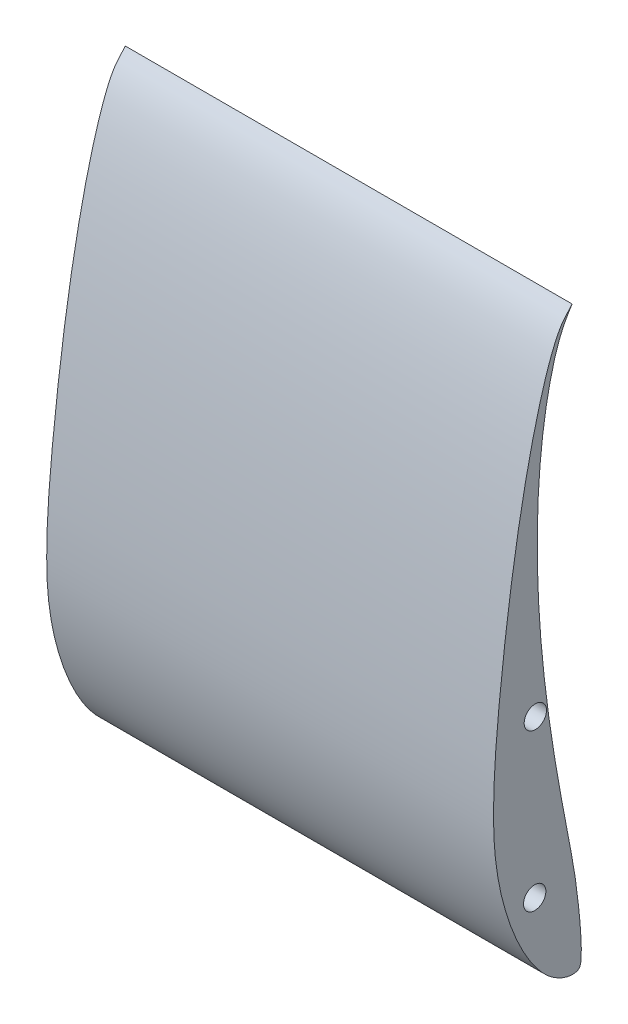
ISO-10303-21;
HEADER;
FILE_DESCRIPTION(('STEP AP214'),'2;1');
FILE_NAME('part.step','',(''),(''),'','','');
FILE_SCHEMA(('AUTOMOTIVE_DESIGN { 1 0 10303 214 1 1 1 1 }'));
ENDSEC;
DATA;
#1=APPLICATION_CONTEXT('core data for automotive mechanical design processes');
#2=APPLICATION_PROTOCOL_DEFINITION('international standard','automotive_design',2000,#1);
#3=PRODUCT_CONTEXT('',#1,'mechanical');
#4=PRODUCT('Part','Part','',(#3));
#5=PRODUCT_RELATED_PRODUCT_CATEGORY('part','',(#4));
#6=PRODUCT_DEFINITION_FORMATION('','',#4);
#7=PRODUCT_DEFINITION_CONTEXT('part definition',#1,'design');
#8=PRODUCT_DEFINITION('design','',#6,#7);
#9=PRODUCT_DEFINITION_SHAPE('','',#8);
#10=(LENGTH_UNIT() NAMED_UNIT(*) SI_UNIT(.MILLI.,.METRE.));
#11=(NAMED_UNIT(*) PLANE_ANGLE_UNIT() SI_UNIT($,.RADIAN.));
#12=(NAMED_UNIT(*) SI_UNIT($,.STERADIAN.) SOLID_ANGLE_UNIT());
#13=UNCERTAINTY_MEASURE_WITH_UNIT(LENGTH_MEASURE(1.E-05),#10,'distance_accuracy_value','');
#14=(GEOMETRIC_REPRESENTATION_CONTEXT(3) GLOBAL_UNCERTAINTY_ASSIGNED_CONTEXT((#13)) GLOBAL_UNIT_ASSIGNED_CONTEXT((#10,
#11,#12)) REPRESENTATION_CONTEXT('',''));
#15=CARTESIAN_POINT('',(0.,0.,0.));
#16=DIRECTION('',(0.,0.,1.));
#17=DIRECTION('',(1.,0.,0.));
#18=AXIS2_PLACEMENT_3D('',#15,#16,#17);
#19=CARTESIAN_POINT('',(200.,1.55423199611564,5.68567600596685));
#20=DIRECTION('',(-1.,0.,0.));
#21=DIRECTION('',(0.,0.,1.));
#22=AXIS2_PLACEMENT_3D('',#19,#20,#21);
#23=PLANE('',#22);
#24=CARTESIAN_POINT('',(200.,260.,0.));
#25=CARTESIAN_POINT('',(200.,260.001556519124,0.00661887078384267));
#26=CARTESIAN_POINT('',(200.,259.146840985321,0.643440162747574));
#27=CARTESIAN_POINT('',(200.,258.423988877626,1.35268330546231));
#28=CARTESIAN_POINT('',(200.,256.818965202832,2.83407728046196));
#29=CARTESIAN_POINT('',(200.,254.925412529413,4.40999720160403));
#30=CARTESIAN_POINT('',(200.,252.33519511462,5.99869982550191));
#31=CARTESIAN_POINT('',(200.,249.114240071787,7.53833227135769));
#32=CARTESIAN_POINT('',(200.,245.225789300325,9.14512521457664));
#33=CARTESIAN_POINT('',(200.,240.675769940675,10.7967055515562));
#34=CARTESIAN_POINT('',(200.,235.485409191661,12.4814060934155));
#35=CARTESIAN_POINT('',(200.,229.681652026972,14.184599623952));
#36=CARTESIAN_POINT('',(200.,223.296997868857,15.8982921708335));
#37=CARTESIAN_POINT('',(200.,216.366700018552,17.6067487633523));
#38=CARTESIAN_POINT('',(200.,208.930491682315,19.2976019661041));
#39=CARTESIAN_POINT('',(200.,201.032694494969,20.9602907213059));
#40=CARTESIAN_POINT('',(200.,192.721536069407,22.58626753814));
#41=CARTESIAN_POINT('',(200.,184.045591394932,24.1555238121196));
#42=CARTESIAN_POINT('',(200.,175.059494526374,25.6658175255068));
#43=CARTESIAN_POINT('',(200.,165.81503305599,27.0977007431819));
#44=CARTESIAN_POINT('',(200.,156.371991155488,28.4539694972968));
#45=CARTESIAN_POINT('',(200.,146.790887451545,29.7238760345084));
#46=CARTESIAN_POINT('',(200.,137.141117922647,30.9033567234348));
#47=CARTESIAN_POINT('',(200.,127.499825156734,32.0007629268287));
#48=CARTESIAN_POINT('',(200.,117.946824698256,32.9884042516485));
#49=CARTESIAN_POINT('',(200.,108.559943379205,33.847795867806));
#50=CARTESIAN_POINT('',(200.,99.4052008508868,34.530566521491));
#51=CARTESIAN_POINT('',(200.,90.5348923640869,35.0002251010032));
#52=CARTESIAN_POINT('',(200.,81.9983663443321,35.2030455585767));
#53=CARTESIAN_POINT('',(200.,73.8393542006461,35.1814566459538));
#54=CARTESIAN_POINT('',(200.,66.0730756469091,34.7819675558791));
#55=CARTESIAN_POINT('',(200.,58.6965222391206,33.9724209110688));
#56=CARTESIAN_POINT('',(200.,51.6796656786323,32.8277099500696));
#57=CARTESIAN_POINT('',(200.,45.0208124409399,31.3447470055449));
#58=CARTESIAN_POINT('',(200.,38.7268035266107,29.6057660905646));
#59=CARTESIAN_POINT('',(200.,32.8242696650279,27.6415672196462));
#60=CARTESIAN_POINT('',(200.,27.3383137883816,25.4980832540749));
#61=CARTESIAN_POINT('',(200.,22.3030262690182,23.1867981934877));
#62=CARTESIAN_POINT('',(200.,17.734555034777,20.7546377737146));
#63=CARTESIAN_POINT('',(200.,13.6577540702279,18.2292603569797));
#64=CARTESIAN_POINT('',(200.,10.0981894156519,15.6448869975989));
#65=CARTESIAN_POINT('',(200.,7.05732974398982,13.0562966165563));
#66=CARTESIAN_POINT('',(200.,4.57927286324127,10.4352328045266));
#67=CARTESIAN_POINT('',(200.,2.67580909764275,7.80439403041987));
#68=CARTESIAN_POINT('',(200.,1.26976835461056,5.2449382664266));
#69=CARTESIAN_POINT('',(200.,0.368645037144939,2.81485628150213));
#70=CARTESIAN_POINT('',(200.,-0.0607402673094495,0.571891344484278));
#71=CARTESIAN_POINT('',(200.,0.0221427169291269,-1.32512534994043));
#72=CARTESIAN_POINT('',(200.,0.510537061497363,-3.06499533589435));
#73=CARTESIAN_POINT('',(200.,2.32597704467612,-3.92867954291065));
#74=CARTESIAN_POINT('',(200.,4.76685994000522,-4.04985171708096));
#75=CARTESIAN_POINT('',(200.,8.10597864053378,-4.16729226482359));
#76=CARTESIAN_POINT('',(200.,12.3051560667178,-3.98621491675651));
#77=CARTESIAN_POINT('',(200.,17.3169332187975,-3.65344993377304));
#78=CARTESIAN_POINT('',(200.,23.085534248592,-3.12043258963061));
#79=CARTESIAN_POINT('',(200.,29.5519303816322,-2.39923720544322));
#80=CARTESIAN_POINT('',(200.,36.6845897712565,-1.47438822926255));
#81=CARTESIAN_POINT('',(200.,44.4800267920473,-0.181774171875588));
#82=CARTESIAN_POINT('',(200.,52.97619675808,1.43914290322981));
#83=CARTESIAN_POINT('',(200.,62.2155748001914,3.20321792962444));
#84=CARTESIAN_POINT('',(200.,72.1529995923794,5.06582824821512));
#85=CARTESIAN_POINT('',(200.,82.7260536554749,6.94966285014223));
#86=CARTESIAN_POINT('',(200.,93.8570881020189,8.7840236321061));
#87=CARTESIAN_POINT('',(200.,105.459747593343,10.5076564874055));
#88=CARTESIAN_POINT('',(200.,117.434040944871,12.0573323630042));
#89=CARTESIAN_POINT('',(200.,129.672286689627,13.3879284368073));
#90=CARTESIAN_POINT('',(200.,142.058878737751,14.43970984546));
#91=CARTESIAN_POINT('',(200.,154.46951458544,15.1852931739496));
#92=CARTESIAN_POINT('',(200.,166.774534945766,15.5951816275537));
#93=CARTESIAN_POINT('',(200.,178.840451940908,15.6469534761152));
#94=CARTESIAN_POINT('',(200.,190.532651369404,15.337091064225));
#95=CARTESIAN_POINT('',(200.,201.717250621229,14.6728483313263));
#96=CARTESIAN_POINT('',(200.,212.259756474038,13.662795797397));
#97=CARTESIAN_POINT('',(200.,222.034654083391,12.345704215358));
#98=CARTESIAN_POINT('',(200.,230.91467741257,10.7597906184045));
#99=CARTESIAN_POINT('',(200.,238.795712120133,8.95816921824638));
#100=CARTESIAN_POINT('',(200.,245.532514356521,7.03035405794541));
#101=CARTESIAN_POINT('',(200.,251.04589222455,4.97282328996701));
#102=CARTESIAN_POINT('',(200.,254.979545411021,3.08991922113619));
#103=CARTESIAN_POINT('',(200.,257.879722893753,1.34892287368608));
#104=CARTESIAN_POINT('',(200.,258.993846370692,0.675186007426582));
#105=CARTESIAN_POINT('',(200.,259.998411836983,-0.00675343182846559));
#106=CARTESIAN_POINT('',(200.,260.,0.));
#107=B_SPLINE_CURVE_WITH_KNOTS('',3,(#24,#25,#26,#27,#28,#29,#30,#31,#32,#33,#34,#35,#36,#37,
#38,#39,#40,#41,#42,#43,#44,#45,#46,#47,#48,#49,#50,#51,#52,#53,#54,#55,#56,#57,#58,#59,#60,#61,
#62,#63,#64,#65,#66,#67,#68,#69,#70,#71,#72,#73,#74,#75,#76,#77,#78,#79,#80,#81,#82,#83,#84,#85,
#86,#87,#88,#89,#90,#91,#92,#93,#94,#95,#96,#97,#98,#99,#100,#101,#102,#103,#104,#105,#106),
.UNSPECIFIED.,.T.,.F.,(4,1,1,1,1,1,1,1,1,1,1,1,1,1,1,1,1,1,1,1,1,1,1,1,1,1,1,1,1,1,1,1,1,1,1,1,
1,1,1,1,1,1,1,1,1,1,1,1,1,1,1,1,1,1,1,1,1,1,1,1,1,1,1,1,1,1,1,1,1,1,1,1,1,1,1,1,1,1,1,1,4),(0.,
0.000979677557134172,0.00364886216776309,0.0074834985194781,0.0120952771855933,
0.0175255907768788,0.0240517799938711,0.0317830505527587,0.0406778280832618,0.050710300790478,
0.0618332290621795,0.0739892504845854,0.0871181731906812,0.101145048769791,0.115990637111827,
0.131570421640589,0.147788379302961,0.164550916882416,0.181757895150531,0.199311954944345,
0.217095071712264,0.234990228463986,0.252856883122009,0.270540593729572,0.287886779266045,
0.304773437599674,0.321101419214061,0.336806063174811,0.351800032584037,0.366031063392082,
0.379615674919835,0.392652962879186,0.405170358707495,0.417171919049936,0.428603516911185,
0.43941895910826,0.449596586064162,0.459102079103161,0.467907877534646,0.475988300736527,
0.483308968746149,0.489874507816402,0.495803249719208,0.501149411695553,0.50590307325604,
0.510046768536663,0.513579310681042,0.516446926626751,0.5193500525909,0.523823355179486,
0.529973793997694,0.537715654387927,0.546967844488146,0.55763736682571,0.569620481096633,
0.582804124215616,0.597246960791632,0.613135036654701,0.630443600329816,0.649056123608545,
0.668822256795696,0.689594964002684,0.711189650864602,0.733426688964389,0.756094117504156,
0.778988553684861,0.801889682684954,0.824566597829707,0.846792284880411,0.868338290507787,
0.888978162959066,0.908492011340558,0.926658767581932,0.943286193042322,0.958169210358794,
0.971135821634751,0.981955623079976,0.990251791025976,0.995852565249962,0.999000405686701,1.),.UNSPECIFIED.);
#108=CARTESIAN_POINT('',(200.,260.,0.));
#109=VERTEX_POINT('',#108);
#110=EDGE_CURVE('E10',#109,#109,#107,.T.);
#111=ORIENTED_EDGE('',*,*,#110,.T.);
#112=EDGE_LOOP('',(#111));
#113=FACE_BOUND('',#112,.T.);
#114=CARTESIAN_POINT('',(200.,38.2318929449681,16.7408662765204));
#115=DIRECTION('',(1.,0.,0.));
#116=DIRECTION('',(0.,0.,-1.));
#117=AXIS2_PLACEMENT_3D('',#114,#115,#116);
#118=CIRCLE('',#117,5.00000000000773);
#119=CARTESIAN_POINT('',(200.,38.2318929449681,11.7408662765127));
#120=VERTEX_POINT('',#119);
#121=EDGE_CURVE('E52',#120,#120,#118,.T.);
#122=ORIENTED_EDGE('',*,*,#121,.F.);
#123=EDGE_LOOP('',(#122));
#124=FACE_BOUND('',#123,.T.);
#125=CARTESIAN_POINT('',(200.,108.231892944968,16.4490068354732));
#126=DIRECTION('',(1.,0.,0.));
#127=DIRECTION('',(0.,0.,-1.));
#128=AXIS2_PLACEMENT_3D('',#125,#126,#127);
#129=CIRCLE('',#128,5.00000000000774);
#130=CARTESIAN_POINT('',(200.,108.231892944968,11.4490068354654));
#131=VERTEX_POINT('',#130);
#132=EDGE_CURVE('E64',#131,#131,#129,.T.);
#133=ORIENTED_EDGE('',*,*,#132,.F.);
#134=EDGE_LOOP('',(#133));
#135=FACE_BOUND('',#134,.T.);
#136=ADVANCED_FACE('F37',(#113,#124,#135),#23,.F.);
#137=CARTESIAN_POINT('',(0.,1.55423199611564,5.68567600596685));
#138=DIRECTION('',(-1.,0.,0.));
#139=DIRECTION('',(0.,0.,1.));
#140=AXIS2_PLACEMENT_3D('',#137,#138,#139);
#141=PLANE('',#140);
#142=CARTESIAN_POINT('',(0.,38.2318929449681,16.7408662765204));
#143=DIRECTION('',(1.,0.,0.));
#144=DIRECTION('',(0.,0.,-1.));
#145=AXIS2_PLACEMENT_3D('',#142,#143,#144);
#146=CIRCLE('',#145,5.00000000000773);
#147=CARTESIAN_POINT('',(0.,38.2318929449681,11.7408662765127));
#148=VERTEX_POINT('',#147);
#149=EDGE_CURVE('E57',#148,#148,#146,.T.);
#150=ORIENTED_EDGE('',*,*,#149,.T.);
#151=EDGE_LOOP('',(#150));
#152=FACE_BOUND('',#151,.T.);
#153=CARTESIAN_POINT('',(0.,260.,0.));
#154=CARTESIAN_POINT('',(0.,260.001556519124,0.00661887078384267));
#155=CARTESIAN_POINT('',(0.,259.146840985321,0.643440162747574));
#156=CARTESIAN_POINT('',(0.,258.423988877626,1.35268330546231));
#157=CARTESIAN_POINT('',(0.,256.818965202832,2.83407728046196));
#158=CARTESIAN_POINT('',(0.,254.925412529413,4.40999720160403));
#159=CARTESIAN_POINT('',(0.,252.33519511462,5.99869982550191));
#160=CARTESIAN_POINT('',(0.,249.114240071787,7.53833227135769));
#161=CARTESIAN_POINT('',(0.,245.225789300325,9.14512521457664));
#162=CARTESIAN_POINT('',(0.,240.675769940675,10.7967055515562));
#163=CARTESIAN_POINT('',(0.,235.485409191661,12.4814060934155));
#164=CARTESIAN_POINT('',(0.,229.681652026972,14.184599623952));
#165=CARTESIAN_POINT('',(0.,223.296997868857,15.8982921708335));
#166=CARTESIAN_POINT('',(0.,216.366700018552,17.6067487633523));
#167=CARTESIAN_POINT('',(0.,208.930491682315,19.2976019661041));
#168=CARTESIAN_POINT('',(0.,201.032694494969,20.9602907213059));
#169=CARTESIAN_POINT('',(0.,192.721536069407,22.58626753814));
#170=CARTESIAN_POINT('',(0.,184.045591394932,24.1555238121196));
#171=CARTESIAN_POINT('',(0.,175.059494526374,25.6658175255068));
#172=CARTESIAN_POINT('',(0.,165.81503305599,27.0977007431819));
#173=CARTESIAN_POINT('',(0.,156.371991155488,28.4539694972968));
#174=CARTESIAN_POINT('',(0.,146.790887451545,29.7238760345084));
#175=CARTESIAN_POINT('',(0.,137.141117922647,30.9033567234348));
#176=CARTESIAN_POINT('',(0.,127.499825156734,32.0007629268287));
#177=CARTESIAN_POINT('',(0.,117.946824698256,32.9884042516485));
#178=CARTESIAN_POINT('',(0.,108.559943379205,33.847795867806));
#179=CARTESIAN_POINT('',(0.,99.4052008508868,34.530566521491));
#180=CARTESIAN_POINT('',(0.,90.5348923640869,35.0002251010032));
#181=CARTESIAN_POINT('',(0.,81.9983663443321,35.2030455585767));
#182=CARTESIAN_POINT('',(0.,73.8393542006461,35.1814566459538));
#183=CARTESIAN_POINT('',(0.,66.0730756469091,34.7819675558791));
#184=CARTESIAN_POINT('',(0.,58.6965222391206,33.9724209110688));
#185=CARTESIAN_POINT('',(0.,51.6796656786323,32.8277099500696));
#186=CARTESIAN_POINT('',(0.,45.0208124409399,31.3447470055449));
#187=CARTESIAN_POINT('',(0.,38.7268035266107,29.6057660905646));
#188=CARTESIAN_POINT('',(0.,32.8242696650279,27.6415672196462));
#189=CARTESIAN_POINT('',(0.,27.3383137883816,25.4980832540749));
#190=CARTESIAN_POINT('',(0.,22.3030262690182,23.1867981934877));
#191=CARTESIAN_POINT('',(0.,17.734555034777,20.7546377737146));
#192=CARTESIAN_POINT('',(0.,13.6577540702279,18.2292603569797));
#193=CARTESIAN_POINT('',(0.,10.0981894156519,15.6448869975989));
#194=CARTESIAN_POINT('',(0.,7.05732974398982,13.0562966165563));
#195=CARTESIAN_POINT('',(0.,4.57927286324127,10.4352328045266));
#196=CARTESIAN_POINT('',(0.,2.67580909764275,7.80439403041987));
#197=CARTESIAN_POINT('',(0.,1.26976835461056,5.2449382664266));
#198=CARTESIAN_POINT('',(0.,0.368645037144939,2.81485628150213));
#199=CARTESIAN_POINT('',(0.,-0.0607402673094495,0.571891344484278));
#200=CARTESIAN_POINT('',(0.,0.0221427169291269,-1.32512534994043));
#201=CARTESIAN_POINT('',(0.,0.510537061497363,-3.06499533589435));
#202=CARTESIAN_POINT('',(0.,2.32597704467612,-3.92867954291065));
#203=CARTESIAN_POINT('',(0.,4.76685994000522,-4.04985171708096));
#204=CARTESIAN_POINT('',(0.,8.10597864053378,-4.16729226482359));
#205=CARTESIAN_POINT('',(0.,12.3051560667178,-3.98621491675651));
#206=CARTESIAN_POINT('',(0.,17.3169332187975,-3.65344993377304));
#207=CARTESIAN_POINT('',(0.,23.085534248592,-3.12043258963061));
#208=CARTESIAN_POINT('',(0.,29.5519303816322,-2.39923720544322));
#209=CARTESIAN_POINT('',(0.,36.6845897712565,-1.47438822926255));
#210=CARTESIAN_POINT('',(0.,44.4800267920473,-0.181774171875588));
#211=CARTESIAN_POINT('',(0.,52.97619675808,1.43914290322981));
#212=CARTESIAN_POINT('',(0.,62.2155748001914,3.20321792962444));
#213=CARTESIAN_POINT('',(0.,72.1529995923794,5.06582824821512));
#214=CARTESIAN_POINT('',(0.,82.7260536554749,6.94966285014223));
#215=CARTESIAN_POINT('',(0.,93.8570881020189,8.7840236321061));
#216=CARTESIAN_POINT('',(0.,105.459747593343,10.5076564874055));
#217=CARTESIAN_POINT('',(0.,117.434040944871,12.0573323630042));
#218=CARTESIAN_POINT('',(0.,129.672286689627,13.3879284368073));
#219=CARTESIAN_POINT('',(0.,142.058878737751,14.43970984546));
#220=CARTESIAN_POINT('',(0.,154.46951458544,15.1852931739496));
#221=CARTESIAN_POINT('',(0.,166.774534945766,15.5951816275537));
#222=CARTESIAN_POINT('',(0.,178.840451940908,15.6469534761152));
#223=CARTESIAN_POINT('',(0.,190.532651369404,15.337091064225));
#224=CARTESIAN_POINT('',(0.,201.717250621229,14.6728483313263));
#225=CARTESIAN_POINT('',(0.,212.259756474038,13.662795797397));
#226=CARTESIAN_POINT('',(0.,222.034654083391,12.345704215358));
#227=CARTESIAN_POINT('',(0.,230.91467741257,10.7597906184045));
#228=CARTESIAN_POINT('',(0.,238.795712120133,8.95816921824638));
#229=CARTESIAN_POINT('',(0.,245.532514356521,7.03035405794541));
#230=CARTESIAN_POINT('',(0.,251.04589222455,4.97282328996701));
#231=CARTESIAN_POINT('',(0.,254.979545411021,3.08991922113619));
#232=CARTESIAN_POINT('',(0.,257.879722893753,1.34892287368608));
#233=CARTESIAN_POINT('',(0.,258.993846370692,0.675186007426582));
#234=CARTESIAN_POINT('',(0.,259.998411836983,-0.00675343182846559));
#235=CARTESIAN_POINT('',(0.,260.,0.));
#236=B_SPLINE_CURVE_WITH_KNOTS('',3,(#153,#154,#155,#156,#157,#158,#159,#160,#161,#162,#163,
#164,#165,#166,#167,#168,#169,#170,#171,#172,#173,#174,#175,#176,#177,#178,#179,#180,#181,#182,
#183,#184,#185,#186,#187,#188,#189,#190,#191,#192,#193,#194,#195,#196,#197,#198,#199,#200,#201,
#202,#203,#204,#205,#206,#207,#208,#209,#210,#211,#212,#213,#214,#215,#216,#217,#218,#219,#220,
#221,#222,#223,#224,#225,#226,#227,#228,#229,#230,#231,#232,#233,#234,#235),.UNSPECIFIED.,.T.,
.F.,(4,1,1,1,1,1,1,1,1,1,1,1,1,1,1,1,1,1,1,1,1,1,1,1,1,1,1,1,1,1,1,1,1,1,1,1,1,1,1,1,1,1,1,1,1,
1,1,1,1,1,1,1,1,1,1,1,1,1,1,1,1,1,1,1,1,1,1,1,1,1,1,1,1,1,1,1,1,1,1,1,4),(0.,
0.000979677557134172,0.00364886216776309,0.0074834985194781,0.0120952771855933,
0.0175255907768788,0.0240517799938711,0.0317830505527587,0.0406778280832618,0.050710300790478,
0.0618332290621795,0.0739892504845854,0.0871181731906812,0.101145048769791,0.115990637111827,
0.131570421640589,0.147788379302961,0.164550916882416,0.181757895150531,0.199311954944345,
0.217095071712264,0.234990228463986,0.252856883122009,0.270540593729572,0.287886779266045,
0.304773437599674,0.321101419214061,0.336806063174811,0.351800032584037,0.366031063392082,
0.379615674919835,0.392652962879186,0.405170358707495,0.417171919049936,0.428603516911185,
0.43941895910826,0.449596586064162,0.459102079103161,0.467907877534646,0.475988300736527,
0.483308968746149,0.489874507816402,0.495803249719208,0.501149411695553,0.50590307325604,
0.510046768536663,0.513579310681042,0.516446926626751,0.5193500525909,0.523823355179486,
0.529973793997694,0.537715654387927,0.546967844488146,0.55763736682571,0.569620481096633,
0.582804124215616,0.597246960791632,0.613135036654701,0.630443600329816,0.649056123608545,
0.668822256795696,0.689594964002684,0.711189650864602,0.733426688964389,0.756094117504156,
0.778988553684861,0.801889682684954,0.824566597829707,0.846792284880411,0.868338290507787,
0.888978162959066,0.908492011340558,0.926658767581932,0.943286193042322,0.958169210358794,
0.971135821634751,0.981955623079976,0.990251791025976,0.995852565249962,0.999000405686701,1.),.UNSPECIFIED.);
#237=CARTESIAN_POINT('',(0.,260.,0.));
#238=VERTEX_POINT('',#237);
#239=EDGE_CURVE('E42',#238,#238,#236,.T.);
#240=ORIENTED_EDGE('',*,*,#239,.F.);
#241=EDGE_LOOP('',(#240));
#242=FACE_BOUND('',#241,.T.);
#243=CARTESIAN_POINT('',(0.,108.231892944968,16.4490068354732));
#244=DIRECTION('',(1.,0.,0.));
#245=DIRECTION('',(0.,0.,-1.));
#246=AXIS2_PLACEMENT_3D('',#243,#244,#245);
#247=CIRCLE('',#246,5.00000000000774);
#248=CARTESIAN_POINT('',(0.,108.231892944968,11.4490068354654));
#249=VERTEX_POINT('',#248);
#250=EDGE_CURVE('E68',#249,#249,#247,.T.);
#251=ORIENTED_EDGE('',*,*,#250,.T.);
#252=EDGE_LOOP('',(#251));
#253=FACE_BOUND('',#252,.T.);
#254=ADVANCED_FACE('F80',(#152,#242,#253),#141,.T.);
#255=DIRECTION('',(-1.,0.,0.));
#256=VECTOR('',#255,1.);
#257=SURFACE_OF_LINEAR_EXTRUSION('',#107,#256);
#258=ORIENTED_EDGE('',*,*,#110,.F.);
#259=EDGE_LOOP('',(#258));
#260=FACE_BOUND('',#259,.T.);
#261=ORIENTED_EDGE('',*,*,#239,.T.);
#262=EDGE_LOOP('',(#261));
#263=FACE_BOUND('',#262,.T.);
#264=ADVANCED_FACE('F39',(#260,#263),#257,.F.);
#265=CARTESIAN_POINT('',(200.,38.2318929449681,16.7408662765204));
#266=DIRECTION('',(-1.,0.,0.));
#267=DIRECTION('',(0.,0.,1.));
#268=AXIS2_PLACEMENT_3D('',#265,#266,#267);
#269=CYLINDRICAL_SURFACE('',#268,5.00000000000773);
#270=ORIENTED_EDGE('',*,*,#121,.T.);
#271=EDGE_LOOP('',(#270));
#272=FACE_BOUND('',#271,.T.);
#273=ORIENTED_EDGE('',*,*,#149,.F.);
#274=EDGE_LOOP('',(#273));
#275=FACE_BOUND('',#274,.T.);
#276=ADVANCED_FACE('F88',(#272,#275),#269,.F.);
#277=CARTESIAN_POINT('',(200.,108.231892944968,16.4490068354732));
#278=DIRECTION('',(-1.,0.,0.));
#279=DIRECTION('',(0.,0.,1.));
#280=AXIS2_PLACEMENT_3D('',#277,#278,#279);
#281=CYLINDRICAL_SURFACE('',#280,5.00000000000774);
#282=ORIENTED_EDGE('',*,*,#132,.T.);
#283=EDGE_LOOP('',(#282));
#284=FACE_BOUND('',#283,.T.);
#285=ORIENTED_EDGE('',*,*,#250,.F.);
#286=EDGE_LOOP('',(#285));
#287=FACE_BOUND('',#286,.T.);
#288=ADVANCED_FACE('F76',(#284,#287),#281,.F.);
#289=CLOSED_SHELL('',(#136,#254,#264,#276,#288));
#290=MANIFOLD_SOLID_BREP('B2',#289);
#291=ADVANCED_BREP_SHAPE_REPRESENTATION('',(#18,#290),#14);
#292=SHAPE_DEFINITION_REPRESENTATION(#9,#291);
ENDSEC;
END-ISO-10303-21;
